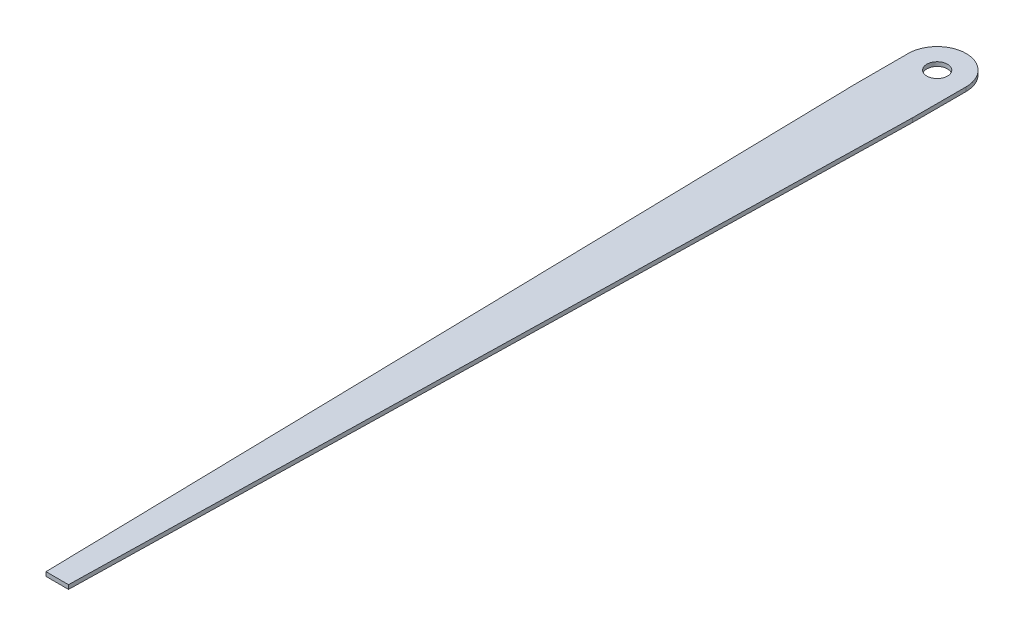
ISO-10303-21;
HEADER;
FILE_DESCRIPTION(('STEP AP214'),'2;1');
FILE_NAME('part.step','',(''),(''),'','','');
FILE_SCHEMA(('AUTOMOTIVE_DESIGN { 1 0 10303 214 1 1 1 1 }'));
ENDSEC;
DATA;
#1=APPLICATION_CONTEXT('core data for automotive mechanical design processes');
#2=APPLICATION_PROTOCOL_DEFINITION('international standard','automotive_design',2000,#1);
#3=PRODUCT_CONTEXT('',#1,'mechanical');
#4=PRODUCT('Part','Part','',(#3));
#5=PRODUCT_RELATED_PRODUCT_CATEGORY('part','',(#4));
#6=PRODUCT_DEFINITION_FORMATION('','',#4);
#7=PRODUCT_DEFINITION_CONTEXT('part definition',#1,'design');
#8=PRODUCT_DEFINITION('design','',#6,#7);
#9=PRODUCT_DEFINITION_SHAPE('','',#8);
#10=(LENGTH_UNIT() NAMED_UNIT(*) SI_UNIT(.MILLI.,.METRE.));
#11=(NAMED_UNIT(*) PLANE_ANGLE_UNIT() SI_UNIT($,.RADIAN.));
#12=(NAMED_UNIT(*) SI_UNIT($,.STERADIAN.) SOLID_ANGLE_UNIT());
#13=UNCERTAINTY_MEASURE_WITH_UNIT(LENGTH_MEASURE(1.E-05),#10,'distance_accuracy_value','');
#14=(GEOMETRIC_REPRESENTATION_CONTEXT(3) GLOBAL_UNCERTAINTY_ASSIGNED_CONTEXT((#13)) GLOBAL_UNIT_ASSIGNED_CONTEXT((#10,
#11,#12)) REPRESENTATION_CONTEXT('',''));
#15=CARTESIAN_POINT('',(0.,0.,0.));
#16=DIRECTION('',(0.,0.,1.));
#17=DIRECTION('',(1.,0.,0.));
#18=AXIS2_PLACEMENT_3D('',#15,#16,#17);
#19=CARTESIAN_POINT('',(4.27304768457271,1.,-0.091336394257846));
#20=DIRECTION('',(-0.999771632938598,0.,0.0213701186540625));
#21=DIRECTION('',(0.0213701186540625,0.,0.999771632938598));
#22=AXIS2_PLACEMENT_3D('',#19,#20,#21);
#23=PLANE('',#22);
#24=DIRECTION('',(-0.0213701186540625,0.,-0.999771632938598));
#25=VECTOR('',#24,1.);
#26=CARTESIAN_POINT('',(4.27304768457271,0.,-0.091336394257846));
#27=LINE('',#26,#25);
#28=CARTESIAN_POINT('',(4.27500000000003,0.,0.));
#29=VERTEX_POINT('',#28);
#30=CARTESIAN_POINT('',(0.,0.,-200.));
#31=VERTEX_POINT('',#30);
#32=EDGE_CURVE('E151',#29,#31,#27,.T.);
#33=ORIENTED_EDGE('',*,*,#32,.F.);
#34=DIRECTION('',(0.,-1.,0.));
#35=VECTOR('',#34,1.);
#36=CARTESIAN_POINT('',(4.27500000000003,1.,0.));
#37=LINE('',#36,#35);
#38=CARTESIAN_POINT('',(4.27500000000003,1.,0.));
#39=VERTEX_POINT('',#38);
#40=EDGE_CURVE('E12',#39,#29,#37,.T.);
#41=ORIENTED_EDGE('',*,*,#40,.F.);
#42=DIRECTION('',(-0.0213701186540625,0.,-0.999771632938598));
#43=VECTOR('',#42,1.);
#44=CARTESIAN_POINT('',(4.27304768457271,1.,-0.091336394257846));
#45=LINE('',#44,#43);
#46=CARTESIAN_POINT('',(0.,1.,-200.));
#47=VERTEX_POINT('',#46);
#48=EDGE_CURVE('E70',#39,#47,#45,.T.);
#49=ORIENTED_EDGE('',*,*,#48,.T.);
#50=DIRECTION('',(0.,-1.,0.));
#51=VECTOR('',#50,1.);
#52=CARTESIAN_POINT('',(0.,1.,-200.));
#53=LINE('',#52,#51);
#54=EDGE_CURVE('E89',#47,#31,#53,.T.);
#55=ORIENTED_EDGE('',*,*,#54,.T.);
#56=EDGE_LOOP('',(#33,#41,#49,#55));
#57=FACE_BOUND('',#56,.T.);
#58=ADVANCED_FACE('F54',(#57),#23,.T.);
#59=CARTESIAN_POINT('',(0.,1.,0.));
#60=DIRECTION('',(0.,0.,-1.));
#61=DIRECTION('',(-1.,0.,0.));
#62=AXIS2_PLACEMENT_3D('',#59,#60,#61);
#63=PLANE('',#62);
#64=DIRECTION('',(1.,0.,0.));
#65=VECTOR('',#64,1.);
#66=CARTESIAN_POINT('',(0.,0.,0.));
#67=LINE('',#66,#65);
#68=CARTESIAN_POINT('',(9.72499999999998,0.,0.));
#69=VERTEX_POINT('',#68);
#70=EDGE_CURVE('E84',#29,#69,#67,.T.);
#71=ORIENTED_EDGE('',*,*,#70,.T.);
#72=DIRECTION('',(0.,-1.,0.));
#73=VECTOR('',#72,1.);
#74=CARTESIAN_POINT('',(9.72499999999998,1.,0.));
#75=LINE('',#74,#73);
#76=CARTESIAN_POINT('',(9.72499999999998,1.,0.));
#77=VERTEX_POINT('',#76);
#78=EDGE_CURVE('E62',#77,#69,#75,.T.);
#79=ORIENTED_EDGE('',*,*,#78,.F.);
#80=DIRECTION('',(1.,0.,0.));
#81=VECTOR('',#80,1.);
#82=CARTESIAN_POINT('',(0.,1.,0.));
#83=LINE('',#82,#81);
#84=EDGE_CURVE('E147',#39,#77,#83,.T.);
#85=ORIENTED_EDGE('',*,*,#84,.F.);
#86=ORIENTED_EDGE('',*,*,#40,.T.);
#87=EDGE_LOOP('',(#71,#79,#85,#86));
#88=FACE_BOUND('',#87,.T.);
#89=ADVANCED_FACE('F185',(#88),#63,.F.);
#90=CARTESIAN_POINT('',(9.72055876782918,1.,0.207776943662363));
#91=DIRECTION('',(-0.999771632938598,0.,-0.0213701186540626));
#92=DIRECTION('',(-0.0213701186540626,0.,0.999771632938598));
#93=AXIS2_PLACEMENT_3D('',#90,#91,#92);
#94=PLANE('',#93);
#95=DIRECTION('',(0.0213701186540626,0.,-0.999771632938598));
#96=VECTOR('',#95,1.);
#97=CARTESIAN_POINT('',(9.72055876782918,0.,0.207776943662363));
#98=LINE('',#97,#96);
#99=CARTESIAN_POINT('',(14.,0.,-200.));
#100=VERTEX_POINT('',#99);
#101=EDGE_CURVE('E148',#69,#100,#98,.T.);
#102=ORIENTED_EDGE('',*,*,#101,.T.);
#103=DIRECTION('',(0.,-1.,0.));
#104=VECTOR('',#103,1.);
#105=CARTESIAN_POINT('',(14.,1.,-200.));
#106=LINE('',#105,#104);
#107=CARTESIAN_POINT('',(14.,1.,-200.));
#108=VERTEX_POINT('',#107);
#109=EDGE_CURVE('E156',#108,#100,#106,.T.);
#110=ORIENTED_EDGE('',*,*,#109,.F.);
#111=DIRECTION('',(0.0213701186540626,0.,-0.999771632938598));
#112=VECTOR('',#111,1.);
#113=CARTESIAN_POINT('',(9.72055876782918,1.,0.207776943662363));
#114=LINE('',#113,#112);
#115=EDGE_CURVE('E118',#77,#108,#114,.T.);
#116=ORIENTED_EDGE('',*,*,#115,.F.);
#117=ORIENTED_EDGE('',*,*,#78,.T.);
#118=EDGE_LOOP('',(#102,#110,#116,#117));
#119=FACE_BOUND('',#118,.T.);
#120=ADVANCED_FACE('F159',(#119),#94,.F.);
#121=CARTESIAN_POINT('',(0.,1.,0.));
#122=DIRECTION('',(0.,1.,0.));
#123=DIRECTION('',(0.,0.,1.));
#124=AXIS2_PLACEMENT_3D('',#121,#122,#123);
#125=PLANE('',#124);
#126=ORIENTED_EDGE('',*,*,#48,.F.);
#127=ORIENTED_EDGE('',*,*,#84,.T.);
#128=ORIENTED_EDGE('',*,*,#115,.T.);
#129=DIRECTION('',(0.,0.,-1.));
#130=VECTOR('',#129,1.);
#131=CARTESIAN_POINT('',(14.,1.,-200.));
#132=LINE('',#131,#130);
#133=CARTESIAN_POINT('',(14.,1.,-213.));
#134=VERTEX_POINT('',#133);
#135=EDGE_CURVE('E110',#108,#134,#132,.T.);
#136=ORIENTED_EDGE('',*,*,#135,.T.);
#137=CARTESIAN_POINT('',(7.,1.,-213.));
#138=DIRECTION('',(0.,1.,0.));
#139=DIRECTION('',(0.,0.,1.));
#140=AXIS2_PLACEMENT_3D('',#137,#138,#139);
#141=CIRCLE('',#140,7.);
#142=CARTESIAN_POINT('',(0.,1.,-213.));
#143=VERTEX_POINT('',#142);
#144=EDGE_CURVE('E115',#143,#134,#141,.F.);
#145=ORIENTED_EDGE('',*,*,#144,.F.);
#146=DIRECTION('',(0.,0.,-1.));
#147=VECTOR('',#146,1.);
#148=CARTESIAN_POINT('',(0.,1.,-200.));
#149=LINE('',#148,#147);
#150=EDGE_CURVE('E143',#47,#143,#149,.T.);
#151=ORIENTED_EDGE('',*,*,#150,.F.);
#152=EDGE_LOOP('',(#126,#127,#128,#136,#145,#151));
#153=FACE_BOUND('',#152,.T.);
#154=CARTESIAN_POINT('',(7.,1.,-213.));
#155=DIRECTION('',(0.,1.,0.));
#156=DIRECTION('',(0.,0.,1.));
#157=AXIS2_PLACEMENT_3D('',#154,#155,#156);
#158=CIRCLE('',#157,2.5);
#159=CARTESIAN_POINT('',(7.,1.,-210.5));
#160=VERTEX_POINT('',#159);
#161=EDGE_CURVE('E122',#160,#160,#158,.F.);
#162=ORIENTED_EDGE('',*,*,#161,.T.);
#163=EDGE_LOOP('',(#162));
#164=FACE_BOUND('',#163,.T.);
#165=ADVANCED_FACE('F112',(#153,#164),#125,.T.);
#166=CARTESIAN_POINT('',(0.,0.,0.));
#167=DIRECTION('',(0.,1.,0.));
#168=DIRECTION('',(0.,0.,1.));
#169=AXIS2_PLACEMENT_3D('',#166,#167,#168);
#170=PLANE('',#169);
#171=ORIENTED_EDGE('',*,*,#32,.T.);
#172=DIRECTION('',(0.,0.,-1.));
#173=VECTOR('',#172,1.);
#174=CARTESIAN_POINT('',(0.,0.,-200.));
#175=LINE('',#174,#173);
#176=CARTESIAN_POINT('',(0.,0.,-213.));
#177=VERTEX_POINT('',#176);
#178=EDGE_CURVE('E165',#31,#177,#175,.T.);
#179=ORIENTED_EDGE('',*,*,#178,.T.);
#180=CARTESIAN_POINT('',(7.,0.,-213.));
#181=DIRECTION('',(0.,-1.,0.));
#182=DIRECTION('',(0.,0.,-1.));
#183=AXIS2_PLACEMENT_3D('',#180,#181,#182);
#184=CIRCLE('',#183,7.);
#185=CARTESIAN_POINT('',(14.,0.,-213.));
#186=VERTEX_POINT('',#185);
#187=EDGE_CURVE('E123',#177,#186,#184,.T.);
#188=ORIENTED_EDGE('',*,*,#187,.T.);
#189=DIRECTION('',(0.,0.,-1.));
#190=VECTOR('',#189,1.);
#191=CARTESIAN_POINT('',(14.,0.,-200.));
#192=LINE('',#191,#190);
#193=EDGE_CURVE('E129',#100,#186,#192,.T.);
#194=ORIENTED_EDGE('',*,*,#193,.F.);
#195=ORIENTED_EDGE('',*,*,#101,.F.);
#196=ORIENTED_EDGE('',*,*,#70,.F.);
#197=EDGE_LOOP('',(#171,#179,#188,#194,#195,#196));
#198=FACE_BOUND('',#197,.T.);
#199=CARTESIAN_POINT('',(7.,0.,-213.));
#200=DIRECTION('',(0.,-1.,0.));
#201=DIRECTION('',(0.,0.,-1.));
#202=AXIS2_PLACEMENT_3D('',#199,#200,#201);
#203=CIRCLE('',#202,2.5);
#204=CARTESIAN_POINT('',(7.,0.,-215.5));
#205=VERTEX_POINT('',#204);
#206=EDGE_CURVE('E133',#205,#205,#203,.T.);
#207=ORIENTED_EDGE('',*,*,#206,.F.);
#208=EDGE_LOOP('',(#207));
#209=FACE_BOUND('',#208,.T.);
#210=ADVANCED_FACE('F161',(#198,#209),#170,.F.);
#211=CARTESIAN_POINT('',(0.,25.4131112314674,-200.));
#212=DIRECTION('',(-1.,0.,0.));
#213=DIRECTION('',(0.,0.,1.));
#214=AXIS2_PLACEMENT_3D('',#211,#212,#213);
#215=PLANE('',#214);
#216=ORIENTED_EDGE('',*,*,#54,.F.);
#217=ORIENTED_EDGE('',*,*,#150,.T.);
#218=DIRECTION('',(0.,-1.,0.));
#219=VECTOR('',#218,1.);
#220=CARTESIAN_POINT('',(0.,25.4131112314674,-213.));
#221=LINE('',#220,#219);
#222=EDGE_CURVE('E137',#143,#177,#221,.T.);
#223=ORIENTED_EDGE('',*,*,#222,.T.);
#224=ORIENTED_EDGE('',*,*,#178,.F.);
#225=EDGE_LOOP('',(#216,#217,#223,#224));
#226=FACE_BOUND('',#225,.T.);
#227=ADVANCED_FACE('F174',(#226),#215,.T.);
#228=CARTESIAN_POINT('',(14.,25.4131112314674,-200.));
#229=DIRECTION('',(-1.,0.,0.));
#230=DIRECTION('',(0.,0.,1.));
#231=AXIS2_PLACEMENT_3D('',#228,#229,#230);
#232=PLANE('',#231);
#233=ORIENTED_EDGE('',*,*,#135,.F.);
#234=ORIENTED_EDGE('',*,*,#109,.T.);
#235=ORIENTED_EDGE('',*,*,#193,.T.);
#236=DIRECTION('',(0.,-1.,0.));
#237=VECTOR('',#236,1.);
#238=CARTESIAN_POINT('',(14.,25.4131112314674,-213.));
#239=LINE('',#238,#237);
#240=EDGE_CURVE('E126',#134,#186,#239,.T.);
#241=ORIENTED_EDGE('',*,*,#240,.F.);
#242=EDGE_LOOP('',(#233,#234,#235,#241));
#243=FACE_BOUND('',#242,.T.);
#244=ADVANCED_FACE('F127',(#243),#232,.F.);
#245=CARTESIAN_POINT('',(7.,25.4131112314674,-213.));
#246=DIRECTION('',(0.,-1.,0.));
#247=DIRECTION('',(0.,0.,-1.));
#248=AXIS2_PLACEMENT_3D('',#245,#246,#247);
#249=CYLINDRICAL_SURFACE('',#248,7.);
#250=ORIENTED_EDGE('',*,*,#222,.F.);
#251=ORIENTED_EDGE('',*,*,#144,.T.);
#252=ORIENTED_EDGE('',*,*,#240,.T.);
#253=ORIENTED_EDGE('',*,*,#187,.F.);
#254=EDGE_LOOP('',(#250,#251,#252,#253));
#255=FACE_BOUND('',#254,.T.);
#256=ADVANCED_FACE('F136',(#255),#249,.T.);
#257=CARTESIAN_POINT('',(7.,25.4131112314674,-213.));
#258=DIRECTION('',(0.,-1.,0.));
#259=DIRECTION('',(0.,0.,-1.));
#260=AXIS2_PLACEMENT_3D('',#257,#258,#259);
#261=CYLINDRICAL_SURFACE('',#260,2.5);
#262=ORIENTED_EDGE('',*,*,#206,.T.);
#263=EDGE_LOOP('',(#262));
#264=FACE_BOUND('',#263,.T.);
#265=ORIENTED_EDGE('',*,*,#161,.F.);
#266=EDGE_LOOP('',(#265));
#267=FACE_BOUND('',#266,.T.);
#268=ADVANCED_FACE('F171',(#264,#267),#261,.F.);
#269=CLOSED_SHELL('',(#58,#89,#120,#165,#210,#227,#244,#256,#268));
#270=MANIFOLD_SOLID_BREP('B2',#269);
#271=ADVANCED_BREP_SHAPE_REPRESENTATION('',(#18,#270),#14);
#272=SHAPE_DEFINITION_REPRESENTATION(#9,#271);
ENDSEC;
END-ISO-10303-21;
